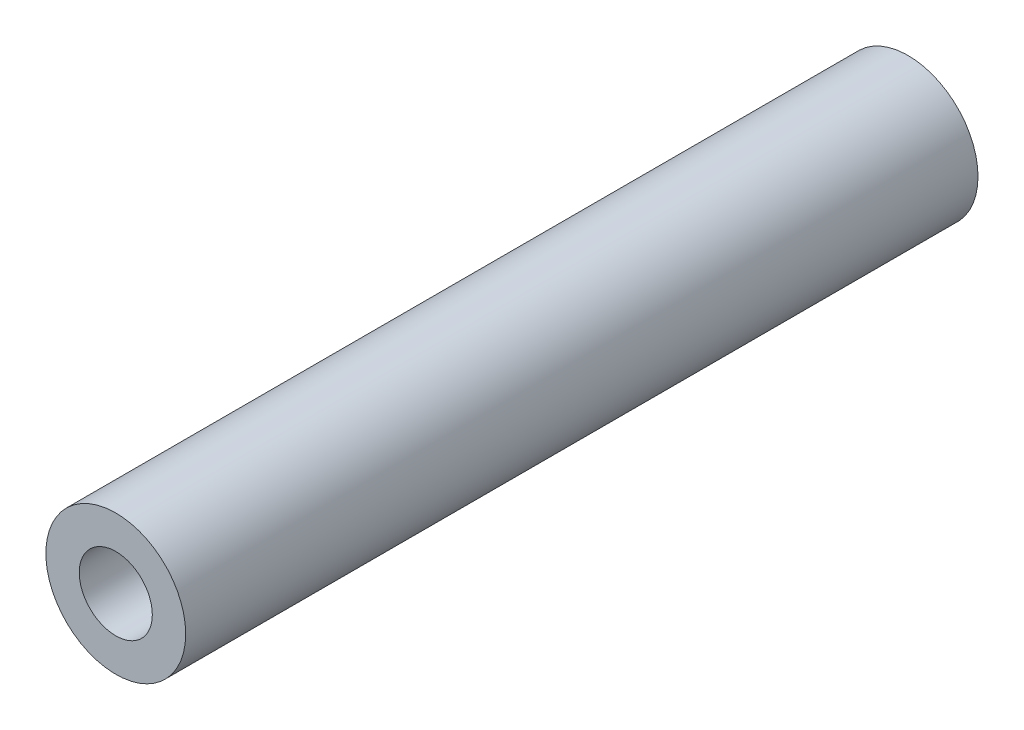
ISO-10303-21;
HEADER;
FILE_DESCRIPTION(('STEP AP214'),'2;1');
FILE_NAME('part.step','',(''),(''),'','','');
FILE_SCHEMA(('AUTOMOTIVE_DESIGN { 1 0 10303 214 1 1 1 1 }'));
ENDSEC;
DATA;
#1=APPLICATION_CONTEXT('core data for automotive mechanical design processes');
#2=APPLICATION_PROTOCOL_DEFINITION('international standard','automotive_design',2000,#1);
#3=PRODUCT_CONTEXT('',#1,'mechanical');
#4=PRODUCT('Part','Part','',(#3));
#5=PRODUCT_RELATED_PRODUCT_CATEGORY('part','',(#4));
#6=PRODUCT_DEFINITION_FORMATION('','',#4);
#7=PRODUCT_DEFINITION_CONTEXT('part definition',#1,'design');
#8=PRODUCT_DEFINITION('design','',#6,#7);
#9=PRODUCT_DEFINITION_SHAPE('','',#8);
#10=(LENGTH_UNIT() NAMED_UNIT(*) SI_UNIT(.MILLI.,.METRE.));
#11=(NAMED_UNIT(*) PLANE_ANGLE_UNIT() SI_UNIT($,.RADIAN.));
#12=(NAMED_UNIT(*) SI_UNIT($,.STERADIAN.) SOLID_ANGLE_UNIT());
#13=UNCERTAINTY_MEASURE_WITH_UNIT(LENGTH_MEASURE(1.E-05),#10,'distance_accuracy_value','');
#14=(GEOMETRIC_REPRESENTATION_CONTEXT(3) GLOBAL_UNCERTAINTY_ASSIGNED_CONTEXT((#13)) GLOBAL_UNIT_ASSIGNED_CONTEXT((#10,
#11,#12)) REPRESENTATION_CONTEXT('',''));
#15=CARTESIAN_POINT('',(0.,0.,0.));
#16=DIRECTION('',(0.,0.,1.));
#17=DIRECTION('',(1.,0.,0.));
#18=AXIS2_PLACEMENT_3D('',#15,#16,#17);
#19=CARTESIAN_POINT('',(0.,0.,26.9875));
#20=DIRECTION('',(0.,0.,1.));
#21=DIRECTION('',(1.,0.,0.));
#22=AXIS2_PLACEMENT_3D('',#19,#20,#21);
#23=PLANE('',#22);
#24=CARTESIAN_POINT('',(0.,0.,26.9875));
#25=DIRECTION('',(0.,0.,1.));
#26=DIRECTION('',(1.,0.,0.));
#27=AXIS2_PLACEMENT_3D('',#24,#25,#26);
#28=CIRCLE('',#27,4.7625);
#29=CARTESIAN_POINT('',(4.7625,0.,26.9875));
#30=VERTEX_POINT('',#29);
#31=EDGE_CURVE('E10',#30,#30,#28,.T.);
#32=ORIENTED_EDGE('',*,*,#31,.T.);
#33=EDGE_LOOP('',(#32));
#34=FACE_BOUND('',#33,.T.);
#35=CARTESIAN_POINT('',(0.,0.,26.9875));
#36=DIRECTION('',(0.,0.,1.));
#37=DIRECTION('',(1.,0.,0.));
#38=AXIS2_PLACEMENT_3D('',#35,#36,#37);
#39=CIRCLE('',#38,2.4892);
#40=CARTESIAN_POINT('',(2.4892,0.,26.9875));
#41=VERTEX_POINT('',#40);
#42=EDGE_CURVE('E56',#41,#41,#39,.T.);
#43=ORIENTED_EDGE('',*,*,#42,.F.);
#44=EDGE_LOOP('',(#43));
#45=FACE_BOUND('',#44,.T.);
#46=ADVANCED_FACE('F43',(#34,#45),#23,.T.);
#47=CARTESIAN_POINT('',(0.,0.,-26.9875));
#48=DIRECTION('',(0.,0.,1.));
#49=DIRECTION('',(1.,0.,0.));
#50=AXIS2_PLACEMENT_3D('',#47,#48,#49);
#51=PLANE('',#50);
#52=CARTESIAN_POINT('',(0.,0.,-26.9875));
#53=DIRECTION('',(0.,0.,1.));
#54=DIRECTION('',(1.,0.,0.));
#55=AXIS2_PLACEMENT_3D('',#52,#53,#54);
#56=CIRCLE('',#55,4.7625);
#57=CARTESIAN_POINT('',(4.7625,0.,-26.9875));
#58=VERTEX_POINT('',#57);
#59=EDGE_CURVE('E47',#58,#58,#56,.T.);
#60=ORIENTED_EDGE('',*,*,#59,.F.);
#61=EDGE_LOOP('',(#60));
#62=FACE_BOUND('',#61,.T.);
#63=CARTESIAN_POINT('',(0.,0.,-26.9875));
#64=DIRECTION('',(0.,0.,1.));
#65=DIRECTION('',(1.,0.,0.));
#66=AXIS2_PLACEMENT_3D('',#63,#64,#65);
#67=CIRCLE('',#66,2.4892);
#68=CARTESIAN_POINT('',(2.4892,0.,-26.9875));
#69=VERTEX_POINT('',#68);
#70=EDGE_CURVE('E58',#69,#69,#67,.T.);
#71=ORIENTED_EDGE('',*,*,#70,.T.);
#72=EDGE_LOOP('',(#71));
#73=FACE_BOUND('',#72,.T.);
#74=ADVANCED_FACE('F70',(#62,#73),#51,.F.);
#75=CARTESIAN_POINT('',(0.,0.,26.9875));
#76=DIRECTION('',(0.,0.,-1.));
#77=DIRECTION('',(-1.,0.,0.));
#78=AXIS2_PLACEMENT_3D('',#75,#76,#77);
#79=CYLINDRICAL_SURFACE('',#78,4.7625);
#80=ORIENTED_EDGE('',*,*,#31,.F.);
#81=EDGE_LOOP('',(#80));
#82=FACE_BOUND('',#81,.T.);
#83=ORIENTED_EDGE('',*,*,#59,.T.);
#84=EDGE_LOOP('',(#83));
#85=FACE_BOUND('',#84,.T.);
#86=ADVANCED_FACE('F45',(#82,#85),#79,.T.);
#87=CARTESIAN_POINT('',(0.,0.,26.9875));
#88=DIRECTION('',(0.,0.,-1.));
#89=DIRECTION('',(-1.,0.,0.));
#90=AXIS2_PLACEMENT_3D('',#87,#88,#89);
#91=CYLINDRICAL_SURFACE('',#90,2.4892);
#92=ORIENTED_EDGE('',*,*,#42,.T.);
#93=EDGE_LOOP('',(#92));
#94=FACE_BOUND('',#93,.T.);
#95=ORIENTED_EDGE('',*,*,#70,.F.);
#96=EDGE_LOOP('',(#95));
#97=FACE_BOUND('',#96,.T.);
#98=ADVANCED_FACE('F66',(#94,#97),#91,.F.);
#99=CLOSED_SHELL('',(#46,#74,#86,#98));
#100=MANIFOLD_SOLID_BREP('B2',#99);
#101=ADVANCED_BREP_SHAPE_REPRESENTATION('',(#18,#100),#14);
#102=SHAPE_DEFINITION_REPRESENTATION(#9,#101);
ENDSEC;
END-ISO-10303-21;
